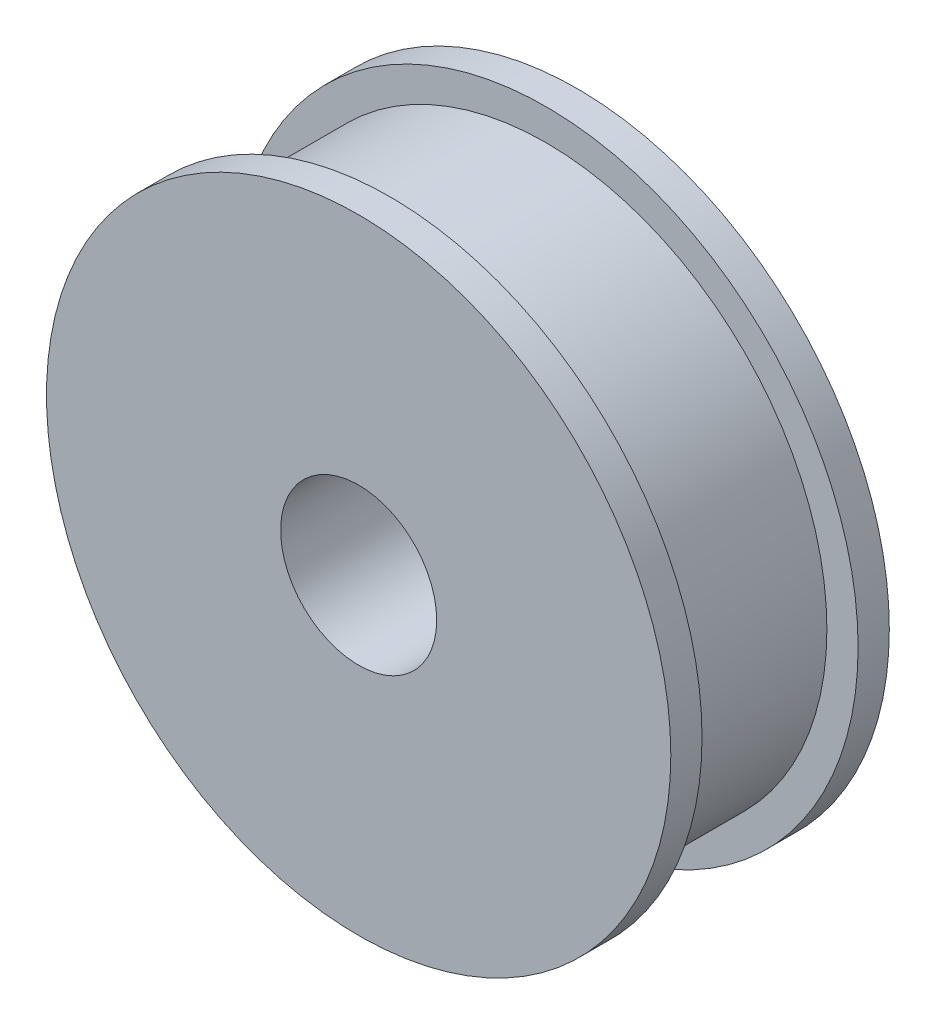
ISO-10303-21;
HEADER;
FILE_DESCRIPTION(('STEP AP214'),'2;1');
FILE_NAME('part.step','',(''),(''),'','','');
FILE_SCHEMA(('AUTOMOTIVE_DESIGN { 1 0 10303 214 1 1 1 1 }'));
ENDSEC;
DATA;
#1=APPLICATION_CONTEXT('core data for automotive mechanical design processes');
#2=APPLICATION_PROTOCOL_DEFINITION('international standard','automotive_design',2000,#1);
#3=PRODUCT_CONTEXT('',#1,'mechanical');
#4=PRODUCT('Part','Part','',(#3));
#5=PRODUCT_RELATED_PRODUCT_CATEGORY('part','',(#4));
#6=PRODUCT_DEFINITION_FORMATION('','',#4);
#7=PRODUCT_DEFINITION_CONTEXT('part definition',#1,'design');
#8=PRODUCT_DEFINITION('design','',#6,#7);
#9=PRODUCT_DEFINITION_SHAPE('','',#8);
#10=(LENGTH_UNIT() NAMED_UNIT(*) SI_UNIT(.MILLI.,.METRE.));
#11=(NAMED_UNIT(*) PLANE_ANGLE_UNIT() SI_UNIT($,.RADIAN.));
#12=(NAMED_UNIT(*) SI_UNIT($,.STERADIAN.) SOLID_ANGLE_UNIT());
#13=UNCERTAINTY_MEASURE_WITH_UNIT(LENGTH_MEASURE(1.E-05),#10,'distance_accuracy_value','');
#14=(GEOMETRIC_REPRESENTATION_CONTEXT(3) GLOBAL_UNCERTAINTY_ASSIGNED_CONTEXT((#13)) GLOBAL_UNIT_ASSIGNED_CONTEXT((#10,
#11,#12)) REPRESENTATION_CONTEXT('',''));
#15=CARTESIAN_POINT('',(0.,0.,0.));
#16=DIRECTION('',(0.,0.,1.));
#17=DIRECTION('',(1.,0.,0.));
#18=AXIS2_PLACEMENT_3D('',#15,#16,#17);
#19=CARTESIAN_POINT('',(0.,0.,2.));
#20=DIRECTION('',(0.,0.,-1.));
#21=DIRECTION('',(-1.,0.,0.));
#22=AXIS2_PLACEMENT_3D('',#19,#20,#21);
#23=CYLINDRICAL_SURFACE('',#22,20.);
#24=CARTESIAN_POINT('',(0.,0.,2.));
#25=DIRECTION('',(0.,0.,1.));
#26=DIRECTION('',(1.,0.,0.));
#27=AXIS2_PLACEMENT_3D('',#24,#25,#26);
#28=CIRCLE('',#27,20.);
#29=CARTESIAN_POINT('',(20.,0.,2.));
#30=VERTEX_POINT('',#29);
#31=EDGE_CURVE('E51',#30,#30,#28,.T.);
#32=ORIENTED_EDGE('',*,*,#31,.F.);
#33=EDGE_LOOP('',(#32));
#34=FACE_BOUND('',#33,.T.);
#35=CARTESIAN_POINT('',(0.,0.,0.));
#36=DIRECTION('',(0.,0.,1.));
#37=DIRECTION('',(1.,0.,0.));
#38=AXIS2_PLACEMENT_3D('',#35,#36,#37);
#39=CIRCLE('',#38,20.);
#40=CARTESIAN_POINT('',(20.,0.,0.));
#41=VERTEX_POINT('',#40);
#42=EDGE_CURVE('E46',#41,#41,#39,.T.);
#43=ORIENTED_EDGE('',*,*,#42,.T.);
#44=EDGE_LOOP('',(#43));
#45=FACE_BOUND('',#44,.T.);
#46=ADVANCED_FACE('F43',(#34,#45),#23,.T.);
#47=CARTESIAN_POINT('',(0.,0.,2.));
#48=DIRECTION('',(0.,0.,1.));
#49=DIRECTION('',(1.,0.,0.));
#50=AXIS2_PLACEMENT_3D('',#47,#48,#49);
#51=PLANE('',#50);
#52=CARTESIAN_POINT('',(0.,0.,2.));
#53=DIRECTION('',(0.,0.,1.));
#54=DIRECTION('',(1.,0.,0.));
#55=AXIS2_PLACEMENT_3D('',#52,#53,#54);
#56=CIRCLE('',#55,18.);
#57=CARTESIAN_POINT('',(18.,0.,2.));
#58=VERTEX_POINT('',#57);
#59=EDGE_CURVE('E10',#58,#58,#56,.T.);
#60=ORIENTED_EDGE('',*,*,#59,.F.);
#61=EDGE_LOOP('',(#60));
#62=FACE_BOUND('',#61,.T.);
#63=ORIENTED_EDGE('',*,*,#31,.T.);
#64=EDGE_LOOP('',(#63));
#65=FACE_BOUND('',#64,.T.);
#66=ADVANCED_FACE('F109',(#62,#65),#51,.T.);
#67=CARTESIAN_POINT('',(0.,0.,0.));
#68=DIRECTION('',(0.,0.,1.));
#69=DIRECTION('',(1.,0.,0.));
#70=AXIS2_PLACEMENT_3D('',#67,#68,#69);
#71=PLANE('',#70);
#72=CARTESIAN_POINT('',(0.,0.,0.));
#73=DIRECTION('',(0.,0.,1.));
#74=DIRECTION('',(1.,0.,0.));
#75=AXIS2_PLACEMENT_3D('',#72,#73,#74);
#76=CIRCLE('',#75,5.);
#77=CARTESIAN_POINT('',(5.,0.,0.));
#78=VERTEX_POINT('',#77);
#79=EDGE_CURVE('E67',#78,#78,#76,.T.);
#80=ORIENTED_EDGE('',*,*,#79,.T.);
#81=EDGE_LOOP('',(#80));
#82=FACE_BOUND('',#81,.T.);
#83=ORIENTED_EDGE('',*,*,#42,.F.);
#84=EDGE_LOOP('',(#83));
#85=FACE_BOUND('',#84,.T.);
#86=ADVANCED_FACE('F79',(#82,#85),#71,.F.);
#87=CARTESIAN_POINT('',(0.,0.,12.));
#88=DIRECTION('',(0.,0.,-1.));
#89=DIRECTION('',(-1.,0.,0.));
#90=AXIS2_PLACEMENT_3D('',#87,#88,#89);
#91=CYLINDRICAL_SURFACE('',#90,18.);
#92=CARTESIAN_POINT('',(0.,0.,12.));
#93=DIRECTION('',(0.,0.,1.));
#94=DIRECTION('',(1.,0.,0.));
#95=AXIS2_PLACEMENT_3D('',#92,#93,#94);
#96=CIRCLE('',#95,18.);
#97=CARTESIAN_POINT('',(18.,0.,12.));
#98=VERTEX_POINT('',#97);
#99=EDGE_CURVE('E58',#98,#98,#96,.T.);
#100=ORIENTED_EDGE('',*,*,#99,.F.);
#101=EDGE_LOOP('',(#100));
#102=FACE_BOUND('',#101,.T.);
#103=ORIENTED_EDGE('',*,*,#59,.T.);
#104=EDGE_LOOP('',(#103));
#105=FACE_BOUND('',#104,.T.);
#106=ADVANCED_FACE('F98',(#102,#105),#91,.T.);
#107=CARTESIAN_POINT('',(0.,0.,14.));
#108=DIRECTION('',(0.,0.,-1.));
#109=DIRECTION('',(-1.,0.,0.));
#110=AXIS2_PLACEMENT_3D('',#107,#108,#109);
#111=CYLINDRICAL_SURFACE('',#110,20.);
#112=CARTESIAN_POINT('',(0.,0.,14.));
#113=DIRECTION('',(0.,0.,1.));
#114=DIRECTION('',(1.,0.,0.));
#115=AXIS2_PLACEMENT_3D('',#112,#113,#114);
#116=CIRCLE('',#115,20.);
#117=CARTESIAN_POINT('',(20.,0.,14.));
#118=VERTEX_POINT('',#117);
#119=EDGE_CURVE('E62',#118,#118,#116,.T.);
#120=ORIENTED_EDGE('',*,*,#119,.F.);
#121=EDGE_LOOP('',(#120));
#122=FACE_BOUND('',#121,.T.);
#123=CARTESIAN_POINT('',(0.,0.,12.));
#124=DIRECTION('',(0.,0.,1.));
#125=DIRECTION('',(1.,0.,0.));
#126=AXIS2_PLACEMENT_3D('',#123,#124,#125);
#127=CIRCLE('',#126,20.);
#128=CARTESIAN_POINT('',(20.,0.,12.));
#129=VERTEX_POINT('',#128);
#130=EDGE_CURVE('E63',#129,#129,#127,.T.);
#131=ORIENTED_EDGE('',*,*,#130,.T.);
#132=EDGE_LOOP('',(#131));
#133=FACE_BOUND('',#132,.T.);
#134=ADVANCED_FACE('F92',(#122,#133),#111,.T.);
#135=CARTESIAN_POINT('',(0.,0.,14.));
#136=DIRECTION('',(0.,0.,1.));
#137=DIRECTION('',(1.,0.,0.));
#138=AXIS2_PLACEMENT_3D('',#135,#136,#137);
#139=PLANE('',#138);
#140=CARTESIAN_POINT('',(0.,0.,14.));
#141=DIRECTION('',(0.,0.,1.));
#142=DIRECTION('',(1.,0.,0.));
#143=AXIS2_PLACEMENT_3D('',#140,#141,#142);
#144=CIRCLE('',#143,5.);
#145=CARTESIAN_POINT('',(5.,0.,14.));
#146=VERTEX_POINT('',#145);
#147=EDGE_CURVE('E71',#146,#146,#144,.T.);
#148=ORIENTED_EDGE('',*,*,#147,.F.);
#149=EDGE_LOOP('',(#148));
#150=FACE_BOUND('',#149,.T.);
#151=ORIENTED_EDGE('',*,*,#119,.T.);
#152=EDGE_LOOP('',(#151));
#153=FACE_BOUND('',#152,.T.);
#154=ADVANCED_FACE('F89',(#150,#153),#139,.T.);
#155=CARTESIAN_POINT('',(0.,0.,12.));
#156=DIRECTION('',(0.,0.,1.));
#157=DIRECTION('',(1.,0.,0.));
#158=AXIS2_PLACEMENT_3D('',#155,#156,#157);
#159=PLANE('',#158);
#160=ORIENTED_EDGE('',*,*,#99,.T.);
#161=EDGE_LOOP('',(#160));
#162=FACE_BOUND('',#161,.T.);
#163=ORIENTED_EDGE('',*,*,#130,.F.);
#164=EDGE_LOOP('',(#163));
#165=FACE_BOUND('',#164,.T.);
#166=ADVANCED_FACE('F85',(#162,#165),#159,.F.);
#167=CARTESIAN_POINT('',(0.,0.,0.));
#168=DIRECTION('',(0.,0.,1.));
#169=DIRECTION('',(1.,0.,0.));
#170=AXIS2_PLACEMENT_3D('',#167,#168,#169);
#171=CYLINDRICAL_SURFACE('',#170,5.);
#172=ORIENTED_EDGE('',*,*,#79,.F.);
#173=EDGE_LOOP('',(#172));
#174=FACE_BOUND('',#173,.T.);
#175=ORIENTED_EDGE('',*,*,#147,.T.);
#176=EDGE_LOOP('',(#175));
#177=FACE_BOUND('',#176,.T.);
#178=ADVANCED_FACE('F82',(#174,#177),#171,.F.);
#179=CLOSED_SHELL('',(#46,#66,#86,#106,#134,#154,#166,#178));
#180=MANIFOLD_SOLID_BREP('B2',#179);
#181=ADVANCED_BREP_SHAPE_REPRESENTATION('',(#18,#180),#14);
#182=SHAPE_DEFINITION_REPRESENTATION(#9,#181);
ENDSEC;
END-ISO-10303-21;
